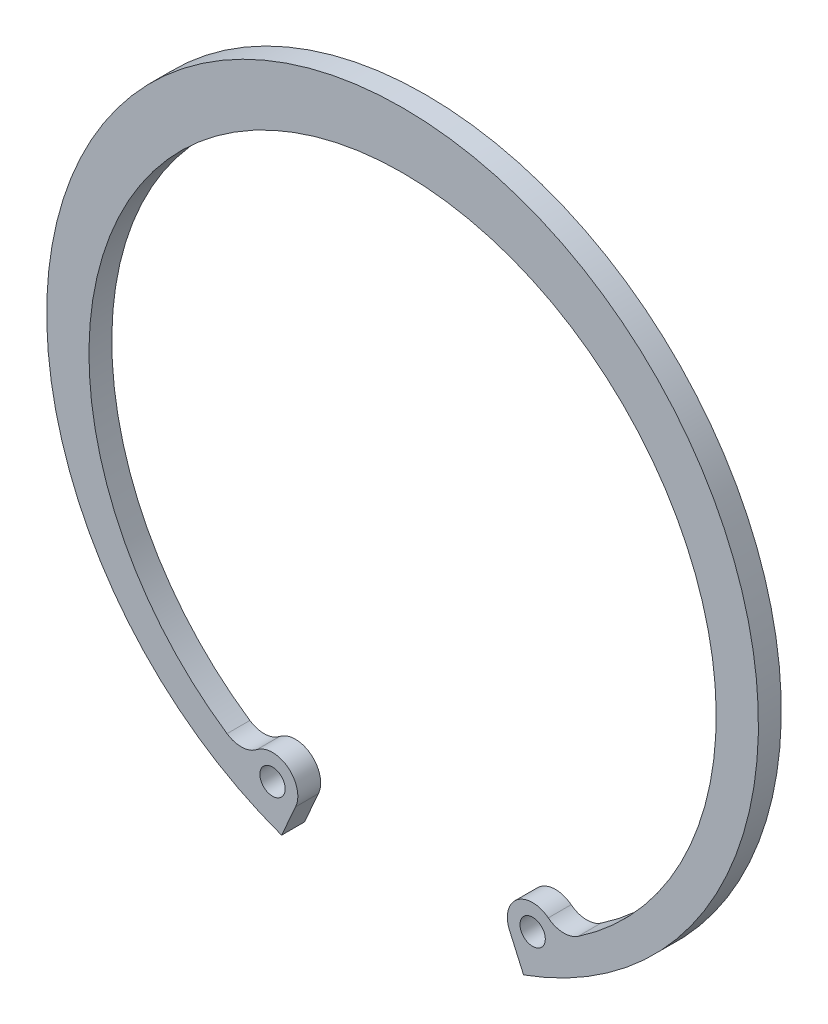
ISO-10303-21;
HEADER;
FILE_DESCRIPTION(('STEP AP214'),'2;1');
FILE_NAME('part.step','',(''),(''),'','','');
FILE_SCHEMA(('AUTOMOTIVE_DESIGN { 1 0 10303 214 1 1 1 1 }'));
ENDSEC;
DATA;
#1=APPLICATION_CONTEXT('core data for automotive mechanical design processes');
#2=APPLICATION_PROTOCOL_DEFINITION('international standard','automotive_design',2000,#1);
#3=PRODUCT_CONTEXT('',#1,'mechanical');
#4=PRODUCT('Part','Part','',(#3));
#5=PRODUCT_RELATED_PRODUCT_CATEGORY('part','',(#4));
#6=PRODUCT_DEFINITION_FORMATION('','',#4);
#7=PRODUCT_DEFINITION_CONTEXT('part definition',#1,'design');
#8=PRODUCT_DEFINITION('design','',#6,#7);
#9=PRODUCT_DEFINITION_SHAPE('','',#8);
#10=(LENGTH_UNIT() NAMED_UNIT(*) SI_UNIT(.MILLI.,.METRE.));
#11=(NAMED_UNIT(*) PLANE_ANGLE_UNIT() SI_UNIT($,.RADIAN.));
#12=(NAMED_UNIT(*) SI_UNIT($,.STERADIAN.) SOLID_ANGLE_UNIT());
#13=UNCERTAINTY_MEASURE_WITH_UNIT(LENGTH_MEASURE(1.E-05),#10,'distance_accuracy_value','');
#14=(GEOMETRIC_REPRESENTATION_CONTEXT(3) GLOBAL_UNCERTAINTY_ASSIGNED_CONTEXT((#13)) GLOBAL_UNIT_ASSIGNED_CONTEXT((#10,
#11,#12)) REPRESENTATION_CONTEXT('',''));
#15=CARTESIAN_POINT('',(0.,0.,0.));
#16=DIRECTION('',(0.,0.,1.));
#17=DIRECTION('',(1.,0.,0.));
#18=AXIS2_PLACEMENT_3D('',#15,#16,#17);
#19=CARTESIAN_POINT('',(-0.0788348748739232,-39.358709824284,0.));
#20=DIRECTION('',(0.,0.,1.));
#21=DIRECTION('',(1.,0.,0.));
#22=AXIS2_PLACEMENT_3D('',#19,#20,#21);
#23=PLANE('',#22);
#24=CARTESIAN_POINT('',(-15.9356811178528,-75.8694377891562,0.));
#25=DIRECTION('',(0.,0.,1.));
#26=DIRECTION('',(1.,0.,0.));
#27=AXIS2_PLACEMENT_3D('',#24,#25,#26);
#28=CIRCLE('',#27,1.55);
#29=CARTESIAN_POINT('',(-14.3856811178528,-75.8694377891562,0.));
#30=VERTEX_POINT('',#29);
#31=EDGE_CURVE('E130',#30,#30,#28,.T.);
#32=ORIENTED_EDGE('',*,*,#31,.T.);
#33=EDGE_LOOP('',(#32));
#34=FACE_BOUND('',#33,.T.);
#35=CARTESIAN_POINT('',(15.9356811178516,-75.8694377891562,0.));
#36=DIRECTION('',(0.,0.,1.));
#37=DIRECTION('',(1.,0.,0.));
#38=AXIS2_PLACEMENT_3D('',#35,#36,#37);
#39=CIRCLE('',#38,1.55);
#40=CARTESIAN_POINT('',(17.4856811178516,-75.8694377891562,0.));
#41=VERTEX_POINT('',#40);
#42=EDGE_CURVE('E133',#41,#41,#39,.T.);
#43=ORIENTED_EDGE('',*,*,#42,.T.);
#44=EDGE_LOOP('',(#43));
#45=FACE_BOUND('',#44,.T.);
#46=CARTESIAN_POINT('',(-19.7715976818713,-70.9985298538849,0.));
#47=DIRECTION('',(0.,0.,1.));
#48=DIRECTION('',(1.,0.,0.));
#49=AXIS2_PLACEMENT_3D('',#46,#47,#48);
#50=CIRCLE('',#49,3.1);
#51=CARTESIAN_POINT('',(-21.506684810358,-73.5674737334897,0.));
#52=VERTEX_POINT('',#51);
#53=CARTESIAN_POINT('',(-17.8536393998625,-73.4339838215206,0.));
#54=VERTEX_POINT('',#53);
#55=EDGE_CURVE('E136',#52,#54,#50,.T.);
#56=ORIENTED_EDGE('',*,*,#55,.T.);
#57=CARTESIAN_POINT('',(-15.9356811178528,-75.8694377891562,0.));
#58=DIRECTION('',(0.,0.,1.));
#59=DIRECTION('',(1.,0.,0.));
#60=AXIS2_PLACEMENT_3D('',#57,#58,#59);
#61=CIRCLE('',#60,3.1);
#62=CARTESIAN_POINT('',(-13.1026809357796,-77.1280520940059,0.));
#63=VERTEX_POINT('',#62);
#64=EDGE_CURVE('E138',#63,#54,#61,.T.);
#65=ORIENTED_EDGE('',*,*,#64,.F.);
#66=DIRECTION('',(0.406004614467569,0.913871026475313,0.));
#67=VECTOR('',#66,1.);
#68=CARTESIAN_POINT('',(-13.1026809357796,-77.1280520940059,0.));
#69=LINE('',#68,#67);
#70=CARTESIAN_POINT('',(-14.8240000000015,-81.0025489939352,0.));
#71=VERTEX_POINT('',#70);
#72=EDGE_CURVE('E103',#71,#63,#69,.T.);
#73=ORIENTED_EDGE('',*,*,#72,.F.);
#74=CARTESIAN_POINT('',(-1.11022302462516E-12,-40.0000000000007,0.));
#75=DIRECTION('',(0.,0.,1.));
#76=DIRECTION('',(1.,0.,0.));
#77=AXIS2_PLACEMENT_3D('',#74,#75,#76);
#78=CIRCLE('',#77,43.6);
#79=CARTESIAN_POINT('',(14.823999999999,-81.0025489939346,0.));
#80=VERTEX_POINT('',#79);
#81=EDGE_CURVE('E140',#80,#71,#78,.T.);
#82=ORIENTED_EDGE('',*,*,#81,.F.);
#83=DIRECTION('',(0.406004614467569,-0.913871026475312,0.));
#84=VECTOR('',#83,1.);
#85=CARTESIAN_POINT('',(14.823999999999,-81.0025489939346,0.));
#86=LINE('',#85,#84);
#87=CARTESIAN_POINT('',(13.1026809357775,-77.1280520940063,0.));
#88=VERTEX_POINT('',#87);
#89=EDGE_CURVE('E107',#88,#80,#86,.T.);
#90=ORIENTED_EDGE('',*,*,#89,.F.);
#91=CARTESIAN_POINT('',(15.9356811178516,-75.8694377891562,0.));
#92=DIRECTION('',(0.,0.,1.));
#93=DIRECTION('',(1.,0.,0.));
#94=AXIS2_PLACEMENT_3D('',#91,#92,#93);
#95=CIRCLE('',#94,3.1);
#96=CARTESIAN_POINT('',(17.8536393998605,-73.433983821521,0.));
#97=VERTEX_POINT('',#96);
#98=EDGE_CURVE('E83',#97,#88,#95,.T.);
#99=ORIENTED_EDGE('',*,*,#98,.F.);
#100=CARTESIAN_POINT('',(19.7715976818692,-70.9985298538844,0.));
#101=DIRECTION('',(0.,0.,1.));
#102=DIRECTION('',(1.,0.,0.));
#103=AXIS2_PLACEMENT_3D('',#100,#101,#102);
#104=CIRCLE('',#103,3.1);
#105=CARTESIAN_POINT('',(21.506684810357,-73.5674737334893,0.));
#106=VERTEX_POINT('',#105);
#107=EDGE_CURVE('E79',#97,#106,#104,.T.);
#108=ORIENTED_EDGE('',*,*,#107,.T.);
#109=CARTESIAN_POINT('',(-1.66533453693773E-12,-41.7250000000011,0.));
#110=DIRECTION('',(0.,0.,1.));
#111=DIRECTION('',(1.,0.,0.));
#112=AXIS2_PLACEMENT_3D('',#109,#110,#111);
#113=CIRCLE('',#112,38.425);
#114=EDGE_CURVE('E19',#106,#52,#113,.T.);
#115=ORIENTED_EDGE('',*,*,#114,.T.);
#116=EDGE_LOOP('',(#56,#65,#73,#82,#90,#99,#108,#115));
#117=FACE_BOUND('',#116,.T.);
#118=ADVANCED_FACE('F16',(#34,#45,#117),#23,.F.);
#119=CARTESIAN_POINT('',(-1.66533453693773E-12,-41.7250000000011,0.));
#120=DIRECTION('',(0.,0.,1.));
#121=DIRECTION('',(1.,0.,0.));
#122=AXIS2_PLACEMENT_3D('',#119,#120,#121);
#123=CYLINDRICAL_SURFACE('',#122,38.425);
#124=DIRECTION('',(0.,0.,1.));
#125=VECTOR('',#124,1.);
#126=CARTESIAN_POINT('',(-21.506684810358,-73.5674737334897,0.));
#127=LINE('',#126,#125);
#128=CARTESIAN_POINT('',(-21.506684810358,-73.5674737334897,2.79999999999991));
#129=VERTEX_POINT('',#128);
#130=EDGE_CURVE('E92',#129,#52,#127,.F.);
#131=ORIENTED_EDGE('',*,*,#130,.T.);
#132=ORIENTED_EDGE('',*,*,#114,.F.);
#133=DIRECTION('',(0.,0.,1.));
#134=VECTOR('',#133,1.);
#135=CARTESIAN_POINT('',(21.506684810357,-73.5674737334893,0.));
#136=LINE('',#135,#134);
#137=CARTESIAN_POINT('',(21.506684810357,-73.5674737334893,2.79999999999991));
#138=VERTEX_POINT('',#137);
#139=EDGE_CURVE('E87',#106,#138,#136,.T.);
#140=ORIENTED_EDGE('',*,*,#139,.T.);
#141=CARTESIAN_POINT('',(-1.66533453693773E-12,-41.7250000000011,2.79999999999991));
#142=DIRECTION('',(0.,0.,1.));
#143=DIRECTION('',(1.,0.,0.));
#144=AXIS2_PLACEMENT_3D('',#141,#142,#143);
#145=CIRCLE('',#144,38.425);
#146=EDGE_CURVE('E128',#129,#138,#145,.F.);
#147=ORIENTED_EDGE('',*,*,#146,.F.);
#148=EDGE_LOOP('',(#131,#132,#140,#147));
#149=FACE_BOUND('',#148,.T.);
#150=ADVANCED_FACE('F89',(#149),#123,.F.);
#151=CARTESIAN_POINT('',(19.7715976818692,-70.9985298538844,0.));
#152=DIRECTION('',(0.,0.,1.));
#153=DIRECTION('',(1.,0.,0.));
#154=AXIS2_PLACEMENT_3D('',#151,#152,#153);
#155=CYLINDRICAL_SURFACE('',#154,3.1);
#156=ORIENTED_EDGE('',*,*,#139,.F.);
#157=ORIENTED_EDGE('',*,*,#107,.F.);
#158=DIRECTION('',(0.,0.,1.));
#159=VECTOR('',#158,1.);
#160=CARTESIAN_POINT('',(17.8536393998605,-73.433983821521,0.));
#161=LINE('',#160,#159);
#162=CARTESIAN_POINT('',(17.8536393998605,-73.433983821521,2.79999999999991));
#163=VERTEX_POINT('',#162);
#164=EDGE_CURVE('E98',#163,#97,#161,.F.);
#165=ORIENTED_EDGE('',*,*,#164,.F.);
#166=CARTESIAN_POINT('',(19.7715976818692,-70.9985298538844,2.79999999999991));
#167=DIRECTION('',(0.,0.,1.));
#168=DIRECTION('',(1.,0.,0.));
#169=AXIS2_PLACEMENT_3D('',#166,#167,#168);
#170=CIRCLE('',#169,3.1);
#171=EDGE_CURVE('E96',#138,#163,#170,.F.);
#172=ORIENTED_EDGE('',*,*,#171,.F.);
#173=EDGE_LOOP('',(#156,#157,#165,#172));
#174=FACE_BOUND('',#173,.T.);
#175=ADVANCED_FACE('F94',(#174),#155,.F.);
#176=CARTESIAN_POINT('',(15.9356811178516,-75.8694377891562,0.));
#177=DIRECTION('',(0.,0.,1.));
#178=DIRECTION('',(1.,0.,0.));
#179=AXIS2_PLACEMENT_3D('',#176,#177,#178);
#180=CYLINDRICAL_SURFACE('',#179,3.1);
#181=ORIENTED_EDGE('',*,*,#98,.T.);
#182=DIRECTION('',(0.,0.,1.));
#183=VECTOR('',#182,1.);
#184=CARTESIAN_POINT('',(13.1026809357775,-77.1280520940063,0.));
#185=LINE('',#184,#183);
#186=CARTESIAN_POINT('',(13.1026809357774,-77.1280520940063,2.79999999999991));
#187=VERTEX_POINT('',#186);
#188=EDGE_CURVE('E109',#187,#88,#185,.F.);
#189=ORIENTED_EDGE('',*,*,#188,.F.);
#190=CARTESIAN_POINT('',(15.9356811178516,-75.8694377891562,2.79999999999991));
#191=DIRECTION('',(0.,0.,1.));
#192=DIRECTION('',(1.,0.,0.));
#193=AXIS2_PLACEMENT_3D('',#190,#191,#192);
#194=CIRCLE('',#193,3.1);
#195=EDGE_CURVE('E124',#163,#187,#194,.T.);
#196=ORIENTED_EDGE('',*,*,#195,.F.);
#197=ORIENTED_EDGE('',*,*,#164,.T.);
#198=EDGE_LOOP('',(#181,#189,#196,#197));
#199=FACE_BOUND('',#198,.T.);
#200=ADVANCED_FACE('F210',(#199),#180,.T.);
#201=CARTESIAN_POINT('',(14.823999999999,-81.0025489939346,0.));
#202=DIRECTION('',(-0.913871026475312,-0.406004614467569,0.));
#203=DIRECTION('',(0.406004614467569,-0.913871026475312,0.));
#204=AXIS2_PLACEMENT_3D('',#201,#202,#203);
#205=PLANE('',#204);
#206=ORIENTED_EDGE('',*,*,#89,.T.);
#207=DIRECTION('',(0.,0.,1.));
#208=VECTOR('',#207,1.);
#209=CARTESIAN_POINT('',(14.823999999999,-81.0025489939346,0.));
#210=LINE('',#209,#208);
#211=CARTESIAN_POINT('',(14.823999999999,-81.0025489939346,2.79999999999991));
#212=VERTEX_POINT('',#211);
#213=EDGE_CURVE('E108',#212,#80,#210,.F.);
#214=ORIENTED_EDGE('',*,*,#213,.F.);
#215=DIRECTION('',(0.406004614467569,-0.913871026475312,0.));
#216=VECTOR('',#215,1.);
#217=CARTESIAN_POINT('',(13.1026809357774,-77.1280520940063,2.79999999999991));
#218=LINE('',#217,#216);
#219=EDGE_CURVE('E123',#187,#212,#218,.T.);
#220=ORIENTED_EDGE('',*,*,#219,.F.);
#221=ORIENTED_EDGE('',*,*,#188,.T.);
#222=EDGE_LOOP('',(#206,#214,#220,#221));
#223=FACE_BOUND('',#222,.T.);
#224=ADVANCED_FACE('F215',(#223),#205,.T.);
#225=CARTESIAN_POINT('',(-1.11022302462516E-12,-40.0000000000007,0.));
#226=DIRECTION('',(0.,0.,1.));
#227=DIRECTION('',(1.,0.,0.));
#228=AXIS2_PLACEMENT_3D('',#225,#226,#227);
#229=CYLINDRICAL_SURFACE('',#228,43.6);
#230=ORIENTED_EDGE('',*,*,#81,.T.);
#231=DIRECTION('',(0.,0.,1.));
#232=VECTOR('',#231,1.);
#233=CARTESIAN_POINT('',(-14.8240000000012,-81.0025489939348,0.));
#234=LINE('',#233,#232);
#235=CARTESIAN_POINT('',(-14.8240000000015,-81.0025489939352,2.79999999999991));
#236=VERTEX_POINT('',#235);
#237=EDGE_CURVE('E106',#236,#71,#234,.F.);
#238=ORIENTED_EDGE('',*,*,#237,.F.);
#239=CARTESIAN_POINT('',(-1.11022302462516E-12,-40.0000000000007,2.79999999999991));
#240=DIRECTION('',(0.,0.,1.));
#241=DIRECTION('',(1.,0.,0.));
#242=AXIS2_PLACEMENT_3D('',#239,#240,#241);
#243=CIRCLE('',#242,43.6);
#244=EDGE_CURVE('E120',#212,#236,#243,.T.);
#245=ORIENTED_EDGE('',*,*,#244,.F.);
#246=ORIENTED_EDGE('',*,*,#213,.T.);
#247=EDGE_LOOP('',(#230,#238,#245,#246));
#248=FACE_BOUND('',#247,.T.);
#249=ADVANCED_FACE('F178',(#248),#229,.T.);
#250=CARTESIAN_POINT('',(-13.1026809357796,-77.1280520940059,0.));
#251=DIRECTION('',(0.913871026475313,-0.406004614467569,0.));
#252=DIRECTION('',(0.406004614467569,0.913871026475313,0.));
#253=AXIS2_PLACEMENT_3D('',#250,#251,#252);
#254=PLANE('',#253);
#255=ORIENTED_EDGE('',*,*,#72,.T.);
#256=DIRECTION('',(0.,0.,1.));
#257=VECTOR('',#256,1.);
#258=CARTESIAN_POINT('',(-13.1026809357796,-77.1280520940059,0.));
#259=LINE('',#258,#257);
#260=CARTESIAN_POINT('',(-13.1026809357796,-77.1280520940059,2.79999999999991));
#261=VERTEX_POINT('',#260);
#262=EDGE_CURVE('E105',#261,#63,#259,.F.);
#263=ORIENTED_EDGE('',*,*,#262,.F.);
#264=DIRECTION('',(0.40600461446757,0.913871026475313,0.));
#265=VECTOR('',#264,1.);
#266=CARTESIAN_POINT('',(-14.8240000000015,-81.0025489939352,2.79999999999991));
#267=LINE('',#266,#265);
#268=EDGE_CURVE('E119',#236,#261,#267,.T.);
#269=ORIENTED_EDGE('',*,*,#268,.F.);
#270=ORIENTED_EDGE('',*,*,#237,.T.);
#271=EDGE_LOOP('',(#255,#263,#269,#270));
#272=FACE_BOUND('',#271,.T.);
#273=ADVANCED_FACE('F163',(#272),#254,.T.);
#274=CARTESIAN_POINT('',(-15.9356811178528,-75.8694377891562,0.));
#275=DIRECTION('',(0.,0.,1.));
#276=DIRECTION('',(1.,0.,0.));
#277=AXIS2_PLACEMENT_3D('',#274,#275,#276);
#278=CYLINDRICAL_SURFACE('',#277,3.1);
#279=ORIENTED_EDGE('',*,*,#64,.T.);
#280=DIRECTION('',(0.,0.,1.));
#281=VECTOR('',#280,1.);
#282=CARTESIAN_POINT('',(-17.8536393998625,-73.4339838215206,0.));
#283=LINE('',#282,#281);
#284=CARTESIAN_POINT('',(-17.8536393998625,-73.4339838215206,2.79999999999991));
#285=VERTEX_POINT('',#284);
#286=EDGE_CURVE('E34',#54,#285,#283,.T.);
#287=ORIENTED_EDGE('',*,*,#286,.T.);
#288=CARTESIAN_POINT('',(-15.9356811178528,-75.8694377891562,2.79999999999991));
#289=DIRECTION('',(0.,0.,1.));
#290=DIRECTION('',(1.,0.,0.));
#291=AXIS2_PLACEMENT_3D('',#288,#289,#290);
#292=CIRCLE('',#291,3.1);
#293=EDGE_CURVE('E116',#261,#285,#292,.T.);
#294=ORIENTED_EDGE('',*,*,#293,.F.);
#295=ORIENTED_EDGE('',*,*,#262,.T.);
#296=EDGE_LOOP('',(#279,#287,#294,#295));
#297=FACE_BOUND('',#296,.T.);
#298=ADVANCED_FACE('F166',(#297),#278,.T.);
#299=CARTESIAN_POINT('',(-19.7715976818713,-70.9985298538849,0.));
#300=DIRECTION('',(0.,0.,1.));
#301=DIRECTION('',(1.,0.,0.));
#302=AXIS2_PLACEMENT_3D('',#299,#300,#301);
#303=CYLINDRICAL_SURFACE('',#302,3.1);
#304=ORIENTED_EDGE('',*,*,#286,.F.);
#305=ORIENTED_EDGE('',*,*,#55,.F.);
#306=ORIENTED_EDGE('',*,*,#130,.F.);
#307=CARTESIAN_POINT('',(-19.7715976818713,-70.9985298538849,2.79999999999991));
#308=DIRECTION('',(0.,0.,1.));
#309=DIRECTION('',(1.,0.,0.));
#310=AXIS2_PLACEMENT_3D('',#307,#308,#309);
#311=CIRCLE('',#310,3.1);
#312=EDGE_CURVE('E113',#285,#129,#311,.F.);
#313=ORIENTED_EDGE('',*,*,#312,.F.);
#314=EDGE_LOOP('',(#304,#305,#306,#313));
#315=FACE_BOUND('',#314,.T.);
#316=ADVANCED_FACE('F168',(#315),#303,.F.);
#317=CARTESIAN_POINT('',(15.9356811178516,-75.8694377891562,0.));
#318=DIRECTION('',(0.,0.,1.));
#319=DIRECTION('',(1.,0.,0.));
#320=AXIS2_PLACEMENT_3D('',#317,#318,#319);
#321=CYLINDRICAL_SURFACE('',#320,1.55);
#322=ORIENTED_EDGE('',*,*,#42,.F.);
#323=EDGE_LOOP('',(#322));
#324=FACE_BOUND('',#323,.T.);
#325=CARTESIAN_POINT('',(15.9356811178516,-75.8694377891562,2.79999999999991));
#326=DIRECTION('',(0.,0.,1.));
#327=DIRECTION('',(1.,0.,0.));
#328=AXIS2_PLACEMENT_3D('',#325,#326,#327);
#329=CIRCLE('',#328,1.55);
#330=CARTESIAN_POINT('',(17.4856811178516,-75.8694377891562,2.79999999999991));
#331=VERTEX_POINT('',#330);
#332=EDGE_CURVE('E25',#331,#331,#329,.F.);
#333=ORIENTED_EDGE('',*,*,#332,.F.);
#334=EDGE_LOOP('',(#333));
#335=FACE_BOUND('',#334,.T.);
#336=ADVANCED_FACE('F175',(#324,#335),#321,.F.);
#337=CARTESIAN_POINT('',(-15.9356811178528,-75.8694377891562,0.));
#338=DIRECTION('',(0.,0.,1.));
#339=DIRECTION('',(1.,0.,0.));
#340=AXIS2_PLACEMENT_3D('',#337,#338,#339);
#341=CYLINDRICAL_SURFACE('',#340,1.55);
#342=ORIENTED_EDGE('',*,*,#31,.F.);
#343=EDGE_LOOP('',(#342));
#344=FACE_BOUND('',#343,.T.);
#345=CARTESIAN_POINT('',(-15.9356811178528,-75.8694377891562,2.79999999999991));
#346=DIRECTION('',(0.,0.,1.));
#347=DIRECTION('',(1.,0.,0.));
#348=AXIS2_PLACEMENT_3D('',#345,#346,#347);
#349=CIRCLE('',#348,1.55);
#350=CARTESIAN_POINT('',(-14.3856811178528,-75.8694377891562,2.79999999999991));
#351=VERTEX_POINT('',#350);
#352=EDGE_CURVE('E11',#351,#351,#349,.F.);
#353=ORIENTED_EDGE('',*,*,#352,.F.);
#354=EDGE_LOOP('',(#353));
#355=FACE_BOUND('',#354,.T.);
#356=ADVANCED_FACE('F181',(#344,#355),#341,.F.);
#357=CARTESIAN_POINT('',(-0.0788348748739232,-39.358709824284,2.79999999999991));
#358=DIRECTION('',(0.,0.,1.));
#359=DIRECTION('',(1.,0.,0.));
#360=AXIS2_PLACEMENT_3D('',#357,#358,#359);
#361=PLANE('',#360);
#362=ORIENTED_EDGE('',*,*,#352,.T.);
#363=EDGE_LOOP('',(#362));
#364=FACE_BOUND('',#363,.T.);
#365=ORIENTED_EDGE('',*,*,#332,.T.);
#366=EDGE_LOOP('',(#365));
#367=FACE_BOUND('',#366,.T.);
#368=ORIENTED_EDGE('',*,*,#293,.T.);
#369=ORIENTED_EDGE('',*,*,#312,.T.);
#370=ORIENTED_EDGE('',*,*,#146,.T.);
#371=ORIENTED_EDGE('',*,*,#171,.T.);
#372=ORIENTED_EDGE('',*,*,#195,.T.);
#373=ORIENTED_EDGE('',*,*,#219,.T.);
#374=ORIENTED_EDGE('',*,*,#244,.T.);
#375=ORIENTED_EDGE('',*,*,#268,.T.);
#376=EDGE_LOOP('',(#368,#369,#370,#371,#372,#373,#374,#375));
#377=FACE_BOUND('',#376,.T.);
#378=ADVANCED_FACE('F160',(#364,#367,#377),#361,.T.);
#379=CLOSED_SHELL('',(#118,#150,#175,#200,#224,#249,#273,#298,#316,#336,#356,#378));
#380=MANIFOLD_SOLID_BREP('B1',#379);
#381=ADVANCED_BREP_SHAPE_REPRESENTATION('',(#18,#380),#14);
#382=SHAPE_DEFINITION_REPRESENTATION(#9,#381);
ENDSEC;
END-ISO-10303-21;
